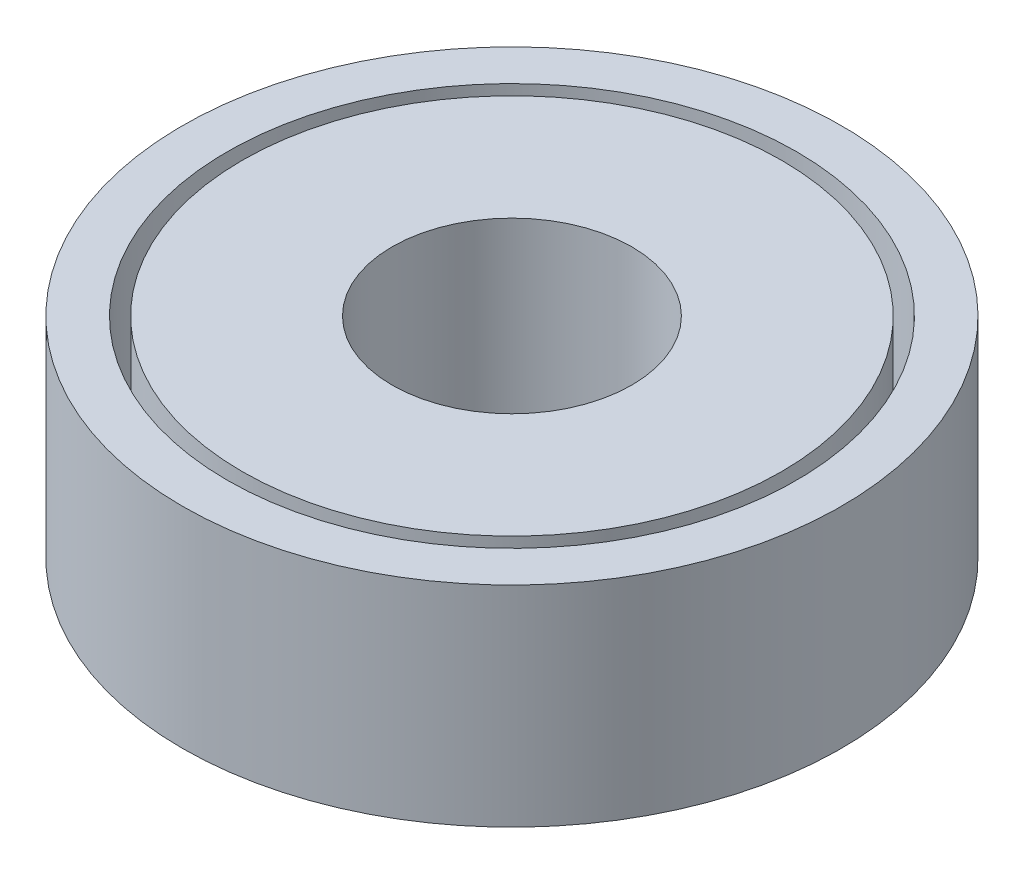
ISO-10303-21;
HEADER;
FILE_DESCRIPTION(('STEP AP214'),'2;1');
FILE_NAME('part.step','',(''),(''),'','','');
FILE_SCHEMA(('AUTOMOTIVE_DESIGN { 1 0 10303 214 1 1 1 1 }'));
ENDSEC;
DATA;
#1=APPLICATION_CONTEXT('core data for automotive mechanical design processes');
#2=APPLICATION_PROTOCOL_DEFINITION('international standard','automotive_design',2000,#1);
#3=PRODUCT_CONTEXT('',#1,'mechanical');
#4=PRODUCT('Part','Part','',(#3));
#5=PRODUCT_RELATED_PRODUCT_CATEGORY('part','',(#4));
#6=PRODUCT_DEFINITION_FORMATION('','',#4);
#7=PRODUCT_DEFINITION_CONTEXT('part definition',#1,'design');
#8=PRODUCT_DEFINITION('design','',#6,#7);
#9=PRODUCT_DEFINITION_SHAPE('','',#8);
#10=(LENGTH_UNIT() NAMED_UNIT(*) SI_UNIT(.MILLI.,.METRE.));
#11=(NAMED_UNIT(*) PLANE_ANGLE_UNIT() SI_UNIT($,.RADIAN.));
#12=(NAMED_UNIT(*) SI_UNIT($,.STERADIAN.) SOLID_ANGLE_UNIT());
#13=UNCERTAINTY_MEASURE_WITH_UNIT(LENGTH_MEASURE(1.E-05),#10,'distance_accuracy_value','');
#14=(GEOMETRIC_REPRESENTATION_CONTEXT(3) GLOBAL_UNCERTAINTY_ASSIGNED_CONTEXT((#13)) GLOBAL_UNIT_ASSIGNED_CONTEXT((#10,
#11,#12)) REPRESENTATION_CONTEXT('',''));
#15=CARTESIAN_POINT('',(0.,0.,0.));
#16=DIRECTION('',(0.,0.,1.));
#17=DIRECTION('',(1.,0.,0.));
#18=AXIS2_PLACEMENT_3D('',#15,#16,#17);
#19=CARTESIAN_POINT('',(0.,7.,0.));
#20=DIRECTION('',(0.,-1.,0.));
#21=DIRECTION('',(0.,0.,-1.));
#22=AXIS2_PLACEMENT_3D('',#19,#20,#21);
#23=CYLINDRICAL_SURFACE('',#22,9.);
#24=CARTESIAN_POINT('',(0.,7.,0.));
#25=DIRECTION('',(0.,1.,0.));
#26=DIRECTION('',(0.,0.,1.));
#27=AXIS2_PLACEMENT_3D('',#24,#25,#26);
#28=CIRCLE('',#27,9.);
#29=CARTESIAN_POINT('',(0.,7.,9.));
#30=VERTEX_POINT('',#29);
#31=EDGE_CURVE('E11',#30,#30,#28,.T.);
#32=ORIENTED_EDGE('',*,*,#31,.F.);
#33=EDGE_LOOP('',(#32));
#34=FACE_BOUND('',#33,.T.);
#35=CARTESIAN_POINT('',(0.,0.,0.));
#36=DIRECTION('',(0.,1.,0.));
#37=DIRECTION('',(0.,0.,1.));
#38=AXIS2_PLACEMENT_3D('',#35,#36,#37);
#39=CIRCLE('',#38,9.);
#40=CARTESIAN_POINT('',(0.,0.,9.));
#41=VERTEX_POINT('',#40);
#42=EDGE_CURVE('E48',#41,#41,#39,.T.);
#43=ORIENTED_EDGE('',*,*,#42,.T.);
#44=EDGE_LOOP('',(#43));
#45=FACE_BOUND('',#44,.T.);
#46=ADVANCED_FACE('F45',(#34,#45),#23,.T.);
#47=CARTESIAN_POINT('',(0.,7.,0.));
#48=DIRECTION('',(0.,1.,0.));
#49=DIRECTION('',(0.,0.,1.));
#50=AXIS2_PLACEMENT_3D('',#47,#48,#49);
#51=PLANE('',#50);
#52=CARTESIAN_POINT('',(0.,7.,0.));
#53=DIRECTION('',(0.,-1.,0.));
#54=DIRECTION('',(0.,0.,-1.));
#55=AXIS2_PLACEMENT_3D('',#52,#53,#54);
#56=CIRCLE('',#55,4.);
#57=CARTESIAN_POINT('',(0.,7.,-4.));
#58=VERTEX_POINT('',#57);
#59=EDGE_CURVE('E55',#58,#58,#56,.T.);
#60=ORIENTED_EDGE('',*,*,#59,.T.);
#61=EDGE_LOOP('',(#60));
#62=FACE_BOUND('',#61,.T.);
#63=ORIENTED_EDGE('',*,*,#31,.T.);
#64=EDGE_LOOP('',(#63));
#65=FACE_BOUND('',#64,.T.);
#66=ADVANCED_FACE('F63',(#62,#65),#51,.T.);
#67=CARTESIAN_POINT('',(0.,0.,0.));
#68=DIRECTION('',(0.,1.,0.));
#69=DIRECTION('',(0.,0.,1.));
#70=AXIS2_PLACEMENT_3D('',#67,#68,#69);
#71=PLANE('',#70);
#72=CARTESIAN_POINT('',(0.,0.,0.));
#73=DIRECTION('',(0.,-1.,0.));
#74=DIRECTION('',(0.,0.,-1.));
#75=AXIS2_PLACEMENT_3D('',#72,#73,#74);
#76=CIRCLE('',#75,4.);
#77=CARTESIAN_POINT('',(0.,0.,-4.));
#78=VERTEX_POINT('',#77);
#79=EDGE_CURVE('E57',#78,#78,#76,.T.);
#80=ORIENTED_EDGE('',*,*,#79,.F.);
#81=EDGE_LOOP('',(#80));
#82=FACE_BOUND('',#81,.T.);
#83=ORIENTED_EDGE('',*,*,#42,.F.);
#84=EDGE_LOOP('',(#83));
#85=FACE_BOUND('',#84,.T.);
#86=ADVANCED_FACE('F68',(#82,#85),#71,.F.);
#87=CARTESIAN_POINT('',(0.,7.,0.));
#88=DIRECTION('',(0.,-1.,0.));
#89=DIRECTION('',(0.,0.,-1.));
#90=AXIS2_PLACEMENT_3D('',#87,#88,#89);
#91=CYLINDRICAL_SURFACE('',#90,4.);
#92=ORIENTED_EDGE('',*,*,#59,.F.);
#93=EDGE_LOOP('',(#92));
#94=FACE_BOUND('',#93,.T.);
#95=ORIENTED_EDGE('',*,*,#79,.T.);
#96=EDGE_LOOP('',(#95));
#97=FACE_BOUND('',#96,.T.);
#98=ADVANCED_FACE('F65',(#94,#97),#91,.F.);
#99=CLOSED_SHELL('',(#46,#66,#86,#98));
#100=MANIFOLD_SOLID_BREP('B2',#99);
#101=CARTESIAN_POINT('',(0.,7.,0.));
#102=DIRECTION('',(0.,-1.,0.));
#103=DIRECTION('',(0.,0.,-1.));
#104=AXIS2_PLACEMENT_3D('',#101,#102,#103);
#105=CYLINDRICAL_SURFACE('',#104,11.);
#106=CARTESIAN_POINT('',(0.,7.,0.));
#107=DIRECTION('',(0.,1.,0.));
#108=DIRECTION('',(0.,0.,1.));
#109=AXIS2_PLACEMENT_3D('',#106,#107,#108);
#110=CIRCLE('',#109,11.);
#111=CARTESIAN_POINT('',(0.,7.,11.));
#112=VERTEX_POINT('',#111);
#113=EDGE_CURVE('E44',#112,#112,#110,.T.);
#114=ORIENTED_EDGE('',*,*,#113,.F.);
#115=EDGE_LOOP('',(#114));
#116=FACE_BOUND('',#115,.T.);
#117=CARTESIAN_POINT('',(0.,0.,0.));
#118=DIRECTION('',(0.,1.,0.));
#119=DIRECTION('',(0.,0.,1.));
#120=AXIS2_PLACEMENT_3D('',#117,#118,#119);
#121=CIRCLE('',#120,11.);
#122=CARTESIAN_POINT('',(0.,0.,11.));
#123=VERTEX_POINT('',#122);
#124=EDGE_CURVE('E117',#123,#123,#121,.T.);
#125=ORIENTED_EDGE('',*,*,#124,.T.);
#126=EDGE_LOOP('',(#125));
#127=FACE_BOUND('',#126,.T.);
#128=ADVANCED_FACE('F114',(#116,#127),#105,.T.);
#129=CARTESIAN_POINT('',(0.,7.,0.));
#130=DIRECTION('',(0.,1.,0.));
#131=DIRECTION('',(0.,0.,1.));
#132=AXIS2_PLACEMENT_3D('',#129,#130,#131);
#133=PLANE('',#132);
#134=CARTESIAN_POINT('',(0.,7.,0.));
#135=DIRECTION('',(0.,1.,0.));
#136=DIRECTION('',(0.,0.,1.));
#137=AXIS2_PLACEMENT_3D('',#134,#135,#136);
#138=CIRCLE('',#137,9.5);
#139=CARTESIAN_POINT('',(0.,7.,9.5));
#140=VERTEX_POINT('',#139);
#141=EDGE_CURVE('E126',#140,#140,#138,.T.);
#142=ORIENTED_EDGE('',*,*,#141,.F.);
#143=EDGE_LOOP('',(#142));
#144=FACE_BOUND('',#143,.T.);
#145=ORIENTED_EDGE('',*,*,#113,.T.);
#146=EDGE_LOOP('',(#145));
#147=FACE_BOUND('',#146,.T.);
#148=ADVANCED_FACE('F141',(#144,#147),#133,.T.);
#149=CARTESIAN_POINT('',(0.,0.,0.));
#150=DIRECTION('',(0.,1.,0.));
#151=DIRECTION('',(0.,0.,1.));
#152=AXIS2_PLACEMENT_3D('',#149,#150,#151);
#153=PLANE('',#152);
#154=CARTESIAN_POINT('',(0.,0.,0.));
#155=DIRECTION('',(0.,1.,0.));
#156=DIRECTION('',(0.,0.,1.));
#157=AXIS2_PLACEMENT_3D('',#154,#155,#156);
#158=CIRCLE('',#157,9.5);
#159=CARTESIAN_POINT('',(0.,0.,9.5));
#160=VERTEX_POINT('',#159);
#161=EDGE_CURVE('E124',#160,#160,#158,.T.);
#162=ORIENTED_EDGE('',*,*,#161,.T.);
#163=EDGE_LOOP('',(#162));
#164=FACE_BOUND('',#163,.T.);
#165=ORIENTED_EDGE('',*,*,#124,.F.);
#166=EDGE_LOOP('',(#165));
#167=FACE_BOUND('',#166,.T.);
#168=ADVANCED_FACE('F132',(#164,#167),#153,.F.);
#169=CARTESIAN_POINT('',(0.,0.,0.));
#170=DIRECTION('',(0.,1.,0.));
#171=DIRECTION('',(0.,0.,1.));
#172=AXIS2_PLACEMENT_3D('',#169,#170,#171);
#173=CYLINDRICAL_SURFACE('',#172,9.5);
#174=ORIENTED_EDGE('',*,*,#161,.F.);
#175=EDGE_LOOP('',(#174));
#176=FACE_BOUND('',#175,.T.);
#177=ORIENTED_EDGE('',*,*,#141,.T.);
#178=EDGE_LOOP('',(#177));
#179=FACE_BOUND('',#178,.T.);
#180=ADVANCED_FACE('F135',(#176,#179),#173,.F.);
#181=CLOSED_SHELL('',(#128,#148,#168,#180));
#182=MANIFOLD_SOLID_BREP('B6',#181);
#183=ADVANCED_BREP_SHAPE_REPRESENTATION('',(#18,#100,#182),#14);
#184=SHAPE_DEFINITION_REPRESENTATION(#9,#183);
ENDSEC;
END-ISO-10303-21;
